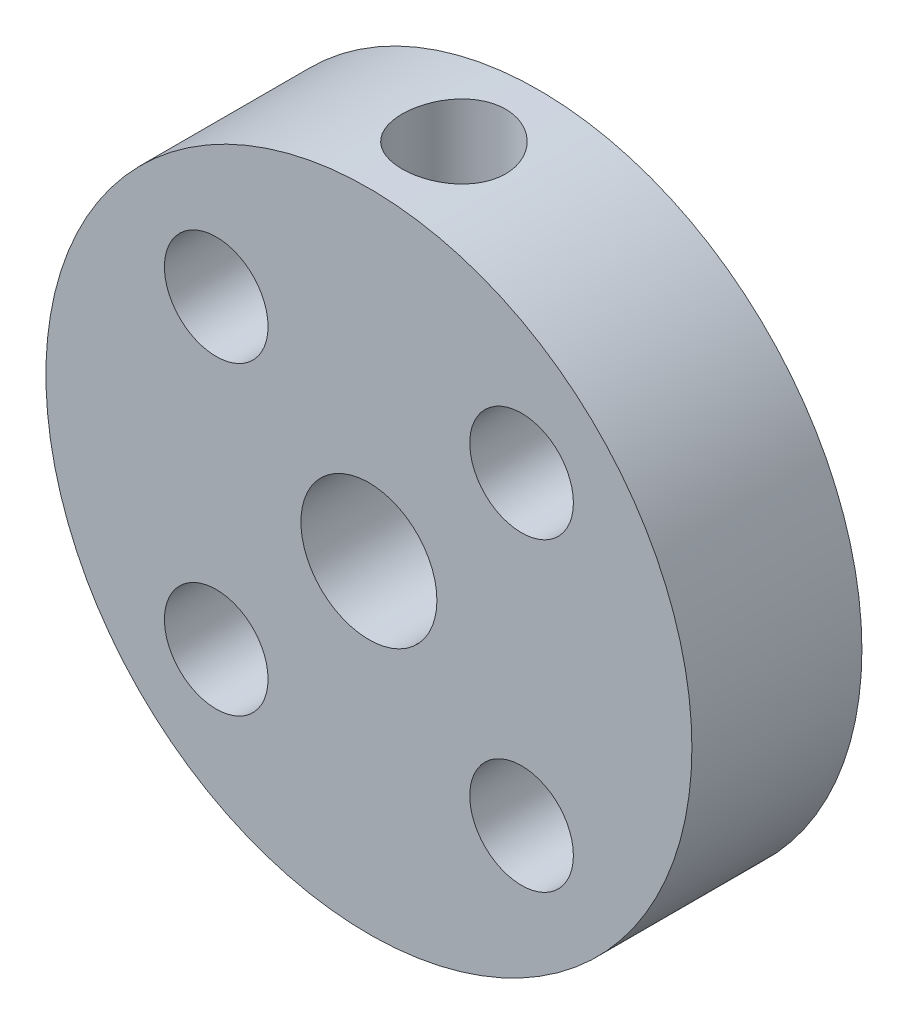
ISO-10303-21;
HEADER;
FILE_DESCRIPTION(('STEP AP214'),'2;1');
FILE_NAME('part.step','',(''),(''),'','','');
FILE_SCHEMA(('AUTOMOTIVE_DESIGN { 1 0 10303 214 1 1 1 1 }'));
ENDSEC;
DATA;
#1=APPLICATION_CONTEXT('core data for automotive mechanical design processes');
#2=APPLICATION_PROTOCOL_DEFINITION('international standard','automotive_design',2000,#1);
#3=PRODUCT_CONTEXT('',#1,'mechanical');
#4=PRODUCT('Part','Part','',(#3));
#5=PRODUCT_RELATED_PRODUCT_CATEGORY('part','',(#4));
#6=PRODUCT_DEFINITION_FORMATION('','',#4);
#7=PRODUCT_DEFINITION_CONTEXT('part definition',#1,'design');
#8=PRODUCT_DEFINITION('design','',#6,#7);
#9=PRODUCT_DEFINITION_SHAPE('','',#8);
#10=(LENGTH_UNIT() NAMED_UNIT(*) SI_UNIT(.MILLI.,.METRE.));
#11=(NAMED_UNIT(*) PLANE_ANGLE_UNIT() SI_UNIT($,.RADIAN.));
#12=(NAMED_UNIT(*) SI_UNIT($,.STERADIAN.) SOLID_ANGLE_UNIT());
#13=UNCERTAINTY_MEASURE_WITH_UNIT(LENGTH_MEASURE(1.E-05),#10,'distance_accuracy_value','');
#14=(GEOMETRIC_REPRESENTATION_CONTEXT(3) GLOBAL_UNCERTAINTY_ASSIGNED_CONTEXT((#13)) GLOBAL_UNIT_ASSIGNED_CONTEXT((#10,
#11,#12)) REPRESENTATION_CONTEXT('',''));
#15=CARTESIAN_POINT('',(0.,0.,0.));
#16=DIRECTION('',(0.,0.,1.));
#17=DIRECTION('',(1.,0.,0.));
#18=AXIS2_PLACEMENT_3D('',#15,#16,#17);
#19=CARTESIAN_POINT('',(0.,0.,5.));
#20=DIRECTION('',(0.,0.,1.));
#21=DIRECTION('',(1.,0.,0.));
#22=AXIS2_PLACEMENT_3D('',#19,#20,#21);
#23=PLANE('',#22);
#24=CARTESIAN_POINT('',(-4.49012806053454,4.49012806053462,5.));
#25=DIRECTION('',(0.,0.,1.));
#26=DIRECTION('',(1.,0.,0.));
#27=AXIS2_PLACEMENT_3D('',#24,#25,#26);
#28=CIRCLE('',#27,1.524);
#29=CARTESIAN_POINT('',(-2.96612806053454,4.49012806053462,5.));
#30=VERTEX_POINT('',#29);
#31=EDGE_CURVE('E64',#30,#30,#28,.T.);
#32=ORIENTED_EDGE('',*,*,#31,.F.);
#33=EDGE_LOOP('',(#32));
#34=FACE_BOUND('',#33,.T.);
#35=CARTESIAN_POINT('',(0.,0.,5.));
#36=DIRECTION('',(0.,0.,1.));
#37=DIRECTION('',(1.,0.,0.));
#38=AXIS2_PLACEMENT_3D('',#35,#36,#37);
#39=CIRCLE('',#38,2.);
#40=CARTESIAN_POINT('',(2.,0.,5.));
#41=VERTEX_POINT('',#40);
#42=EDGE_CURVE('E52',#41,#41,#39,.T.);
#43=ORIENTED_EDGE('',*,*,#42,.F.);
#44=EDGE_LOOP('',(#43));
#45=FACE_BOUND('',#44,.T.);
#46=CARTESIAN_POINT('',(0.,0.,5.));
#47=DIRECTION('',(0.,0.,1.));
#48=DIRECTION('',(1.,0.,0.));
#49=AXIS2_PLACEMENT_3D('',#46,#47,#48);
#50=CIRCLE('',#49,9.5);
#51=CARTESIAN_POINT('',(9.5,0.,5.));
#52=VERTEX_POINT('',#51);
#53=EDGE_CURVE('E10',#52,#52,#50,.T.);
#54=ORIENTED_EDGE('',*,*,#53,.T.);
#55=EDGE_LOOP('',(#54));
#56=FACE_BOUND('',#55,.T.);
#57=CARTESIAN_POINT('',(4.49012806053457,-4.49012806053458,5.));
#58=DIRECTION('',(0.,0.,1.));
#59=DIRECTION('',(1.,0.,0.));
#60=AXIS2_PLACEMENT_3D('',#57,#58,#59);
#61=CIRCLE('',#60,1.524);
#62=CARTESIAN_POINT('',(6.01412806053457,-4.49012806053458,5.));
#63=VERTEX_POINT('',#62);
#64=EDGE_CURVE('E47',#63,#63,#61,.T.);
#65=ORIENTED_EDGE('',*,*,#64,.F.);
#66=EDGE_LOOP('',(#65));
#67=FACE_BOUND('',#66,.T.);
#68=CARTESIAN_POINT('',(-4.4901280605346,-4.49012806053455,5.));
#69=DIRECTION('',(0.,0.,1.));
#70=DIRECTION('',(1.,0.,0.));
#71=AXIS2_PLACEMENT_3D('',#68,#69,#70);
#72=CIRCLE('',#71,1.524);
#73=CARTESIAN_POINT('',(-2.9661280605346,-4.49012806053455,5.));
#74=VERTEX_POINT('',#73);
#75=EDGE_CURVE('E58',#74,#74,#72,.T.);
#76=ORIENTED_EDGE('',*,*,#75,.F.);
#77=EDGE_LOOP('',(#76));
#78=FACE_BOUND('',#77,.T.);
#79=CARTESIAN_POINT('',(4.49012806053463,4.49012806053452,5.));
#80=DIRECTION('',(0.,0.,1.));
#81=DIRECTION('',(1.,0.,0.));
#82=AXIS2_PLACEMENT_3D('',#79,#80,#81);
#83=CIRCLE('',#82,1.524);
#84=CARTESIAN_POINT('',(6.01412806053463,4.49012806053452,5.));
#85=VERTEX_POINT('',#84);
#86=EDGE_CURVE('E70',#85,#85,#83,.T.);
#87=ORIENTED_EDGE('',*,*,#86,.F.);
#88=EDGE_LOOP('',(#87));
#89=FACE_BOUND('',#88,.T.);
#90=ADVANCED_FACE('F36',(#34,#45,#56,#67,#78,#89),#23,.T.);
#91=CARTESIAN_POINT('',(0.,0.,0.));
#92=DIRECTION('',(0.,0.,1.));
#93=DIRECTION('',(1.,0.,0.));
#94=AXIS2_PLACEMENT_3D('',#91,#92,#93);
#95=PLANE('',#94);
#96=CARTESIAN_POINT('',(-4.49012806053454,4.49012806053462,0.));
#97=DIRECTION('',(0.,0.,1.));
#98=DIRECTION('',(1.,0.,0.));
#99=AXIS2_PLACEMENT_3D('',#96,#97,#98);
#100=CIRCLE('',#99,1.524);
#101=CARTESIAN_POINT('',(-2.96612806053454,4.49012806053462,0.));
#102=VERTEX_POINT('',#101);
#103=EDGE_CURVE('E67',#102,#102,#100,.T.);
#104=ORIENTED_EDGE('',*,*,#103,.T.);
#105=EDGE_LOOP('',(#104));
#106=FACE_BOUND('',#105,.T.);
#107=CARTESIAN_POINT('',(0.,0.,0.));
#108=DIRECTION('',(0.,0.,1.));
#109=DIRECTION('',(1.,0.,0.));
#110=AXIS2_PLACEMENT_3D('',#107,#108,#109);
#111=CIRCLE('',#110,2.);
#112=CARTESIAN_POINT('',(2.,0.,0.));
#113=VERTEX_POINT('',#112);
#114=EDGE_CURVE('E55',#113,#113,#111,.T.);
#115=ORIENTED_EDGE('',*,*,#114,.T.);
#116=EDGE_LOOP('',(#115));
#117=FACE_BOUND('',#116,.T.);
#118=CARTESIAN_POINT('',(0.,0.,0.));
#119=DIRECTION('',(0.,0.,1.));
#120=DIRECTION('',(1.,0.,0.));
#121=AXIS2_PLACEMENT_3D('',#118,#119,#120);
#122=CIRCLE('',#121,9.5);
#123=CARTESIAN_POINT('',(9.5,0.,0.));
#124=VERTEX_POINT('',#123);
#125=EDGE_CURVE('E40',#124,#124,#122,.T.);
#126=ORIENTED_EDGE('',*,*,#125,.F.);
#127=EDGE_LOOP('',(#126));
#128=FACE_BOUND('',#127,.T.);
#129=CARTESIAN_POINT('',(4.49012806053457,-4.49012806053458,0.));
#130=DIRECTION('',(0.,0.,1.));
#131=DIRECTION('',(1.,0.,0.));
#132=AXIS2_PLACEMENT_3D('',#129,#130,#131);
#133=CIRCLE('',#132,1.524);
#134=CARTESIAN_POINT('',(6.01412806053457,-4.49012806053458,0.));
#135=VERTEX_POINT('',#134);
#136=EDGE_CURVE('E49',#135,#135,#133,.T.);
#137=ORIENTED_EDGE('',*,*,#136,.T.);
#138=EDGE_LOOP('',(#137));
#139=FACE_BOUND('',#138,.T.);
#140=CARTESIAN_POINT('',(-4.4901280605346,-4.49012806053455,0.));
#141=DIRECTION('',(0.,0.,1.));
#142=DIRECTION('',(1.,0.,0.));
#143=AXIS2_PLACEMENT_3D('',#140,#141,#142);
#144=CIRCLE('',#143,1.524);
#145=CARTESIAN_POINT('',(-2.9661280605346,-4.49012806053455,0.));
#146=VERTEX_POINT('',#145);
#147=EDGE_CURVE('E61',#146,#146,#144,.T.);
#148=ORIENTED_EDGE('',*,*,#147,.T.);
#149=EDGE_LOOP('',(#148));
#150=FACE_BOUND('',#149,.T.);
#151=CARTESIAN_POINT('',(4.49012806053463,4.49012806053452,0.));
#152=DIRECTION('',(0.,0.,1.));
#153=DIRECTION('',(1.,0.,0.));
#154=AXIS2_PLACEMENT_3D('',#151,#152,#153);
#155=CIRCLE('',#154,1.524);
#156=CARTESIAN_POINT('',(6.01412806053463,4.49012806053452,0.));
#157=VERTEX_POINT('',#156);
#158=EDGE_CURVE('E73',#157,#157,#155,.T.);
#159=ORIENTED_EDGE('',*,*,#158,.T.);
#160=EDGE_LOOP('',(#159));
#161=FACE_BOUND('',#160,.T.);
#162=ADVANCED_FACE('F119',(#106,#117,#128,#139,#150,#161),#95,.F.);
#163=CARTESIAN_POINT('',(0.,0.,5.));
#164=DIRECTION('',(0.,0.,-1.));
#165=DIRECTION('',(-1.,0.,0.));
#166=AXIS2_PLACEMENT_3D('',#163,#164,#165);
#167=CYLINDRICAL_SURFACE('',#166,9.5);
#168=CARTESIAN_POINT('',(1.5240000000001,9.37696240794426,2.5));
#169=CARTESIAN_POINT('',(1.52399654514369,9.37696390238986,2.58501071690145));
#170=CARTESIAN_POINT('',(1.51686291108887,9.37813097947758,2.67006898997693));
#171=CARTESIAN_POINT('',(1.48852738850002,9.38266935539468,2.83780222077803));
#172=CARTESIAN_POINT('',(1.46731223691527,9.38604273224212,2.92047485485083));
#173=CARTESIAN_POINT('',(1.41146916769715,9.39460202859444,3.08098489590663));
#174=CARTESIAN_POINT('',(1.37685210490034,9.39978648089324,3.15882615699273));
#175=CARTESIAN_POINT('',(1.2952143479522,9.41138203343417,3.30758608763933));
#176=CARTESIAN_POINT('',(1.24819516977142,9.41779298372922,3.37850560182789));
#177=CARTESIAN_POINT('',(1.14262924417084,9.43118467233009,3.51206655872565));
#178=CARTESIAN_POINT('',(1.08399136273363,9.43816964186715,3.57463555486662));
#179=CARTESIAN_POINT('',(0.957049442106809,9.45188468406259,3.6890906726252));
#180=CARTESIAN_POINT('',(0.888744846694101,9.45861474202508,3.74097617909236));
#181=CARTESIAN_POINT('',(0.743940986216308,9.47110625539872,3.83286165255477));
#182=CARTESIAN_POINT('',(0.667398586832956,9.47686216171781,3.87279446219513));
#183=CARTESIAN_POINT('',(0.508584890338842,9.48670983471568,3.93920960280203));
#184=CARTESIAN_POINT('',(0.426313938984797,9.49080170172864,3.96569274474786));
#185=CARTESIAN_POINT('',(0.259126136306113,9.49683039064271,4.00423594936001));
#186=CARTESIAN_POINT('',(0.17423797874748,9.49878536842639,4.01641759016988));
#187=CARTESIAN_POINT('',(0.00360158507503608,9.5003823262355,4.02638984534965));
#188=CARTESIAN_POINT('',(-0.0821465963501227,9.500024452415,4.02418136906188));
#189=CARTESIAN_POINT('',(-0.251238389724529,9.49705045379422,4.00553133172077));
#190=CARTESIAN_POINT('',(-0.334596848200569,9.49445508658029,3.98922059559731));
#191=CARTESIAN_POINT('',(-0.497378116450145,9.48732084875568,3.94303479202387));
#192=CARTESIAN_POINT('',(-0.576800813298291,9.48278192241613,3.91315933562281));
#193=CARTESIAN_POINT('',(-0.729847775059533,9.47223508175527,3.84056062123073));
#194=CARTESIAN_POINT('',(-0.803445810860905,9.46622097282111,3.79778300565138));
#195=CARTESIAN_POINT('',(-0.942468349551945,9.45339275864658,3.70063404212941));
#196=CARTESIAN_POINT('',(-1.00789223793547,9.44657859333515,3.64626182337246));
#197=CARTESIAN_POINT('',(-1.12948161087487,9.43281847520847,3.52674023027444));
#198=CARTESIAN_POINT('',(-1.18553472984518,9.42587190205809,3.46147655823148));
#199=CARTESIAN_POINT('',(-1.28591204516272,9.41270423425635,3.32241100501416));
#200=CARTESIAN_POINT('',(-1.3302361481558,9.40648314537953,3.24860905588826));
#201=CARTESIAN_POINT('',(-1.40591663975554,9.39547068759003,3.09443670905587));
#202=CARTESIAN_POINT('',(-1.43726026606153,9.39068072703369,3.01405993955356));
#203=CARTESIAN_POINT('',(-1.48597059778895,9.38309676527278,2.8490885510639));
#204=CARTESIAN_POINT('',(-1.50333843813255,9.38030260199892,2.76449427515733));
#205=CARTESIAN_POINT('',(-1.52344755980677,9.37705772673272,2.59449238568458));
#206=CARTESIAN_POINT('',(-1.52634867384512,9.37658140792975,2.5091041508594));
#207=CARTESIAN_POINT('',(-1.51786721675787,9.37795803268871,2.33906169148613));
#208=CARTESIAN_POINT('',(-1.50648515513079,9.37981089316594,2.25440744086438));
#209=CARTESIAN_POINT('',(-1.46989644206301,9.38561349999468,2.08873883040995));
#210=CARTESIAN_POINT('',(-1.44477047866694,9.38955100347972,2.00770618365153));
#211=CARTESIAN_POINT('',(-1.38149155259922,9.39906903469868,1.85100203475306));
#212=CARTESIAN_POINT('',(-1.34333786258204,9.40464965416633,1.77533083223043));
#213=CARTESIAN_POINT('',(-1.25470667855904,9.41688494266829,1.63078426382327));
#214=CARTESIAN_POINT('',(-1.20412635732697,9.42354840764833,1.56197270592282));
#215=CARTESIAN_POINT('',(-1.09221953238032,9.43717256366097,1.4337569642718));
#216=CARTESIAN_POINT('',(-1.03089233043107,9.44413327398364,1.37435339224438));
#217=CARTESIAN_POINT('',(-0.898526095957376,9.45764824984943,1.26605995199878));
#218=CARTESIAN_POINT('',(-0.827399533915524,9.46419797532292,1.21727641877326));
#219=CARTESIAN_POINT('',(-0.677867825574215,9.47608106642354,1.13235112126941));
#220=CARTESIAN_POINT('',(-0.599462901163406,9.48141446911444,1.09620897176505));
#221=CARTESIAN_POINT('',(-0.437922196736007,9.49024419104279,1.03775957527702));
#222=CARTESIAN_POINT('',(-0.354807326083839,9.49374801765891,1.01539572210047));
#223=CARTESIAN_POINT('',(-0.185941062817749,9.49855545456664,0.984955101731097));
#224=CARTESIAN_POINT('',(-0.100189871033508,9.49985923203282,0.976877248989415));
#225=CARTESIAN_POINT('',(0.0704866294857125,9.50011757344635,0.975267336486232));
#226=CARTESIAN_POINT('',(0.155410413212864,9.49909832369643,0.981573137774859));
#227=CARTESIAN_POINT('',(0.322972936038544,9.49487833658826,1.00820205813467));
#228=CARTESIAN_POINT('',(0.405611685701257,9.4916776093172,1.02852511238993));
#229=CARTESIAN_POINT('',(0.566203106303296,9.48345285149482,1.08255120999206));
#230=CARTESIAN_POINT('',(0.644160179365784,9.47843056604109,1.11624145013816));
#231=CARTESIAN_POINT('',(0.793340296417441,9.46711224448121,1.19602783749375));
#232=CARTESIAN_POINT('',(0.864563059349206,9.46081615524708,1.24212450217859));
#233=CARTESIAN_POINT('',(0.999071800668819,9.44756467903416,1.34599450572862));
#234=CARTESIAN_POINT('',(1.06226517545129,9.44060298473112,1.40388697117544));
#235=CARTESIAN_POINT('',(1.1780981547874,9.42684973557823,1.52945482084182));
#236=CARTESIAN_POINT('',(1.23073528318921,9.42005822097314,1.59713249396066));
#237=CARTESIAN_POINT('',(1.32427343081012,9.40736673985615,1.74087027255233));
#238=CARTESIAN_POINT('',(1.36509594095315,9.40147285538368,1.81698200472422));
#239=CARTESIAN_POINT('',(1.43331477885184,9.39131558806267,1.97504387862434));
#240=CARTESIAN_POINT('',(1.46072472145657,9.38705055276927,2.05698800278101));
#241=CARTESIAN_POINT('',(1.49528348488917,9.38159511747144,2.19939221681204));
#242=CARTESIAN_POINT('',(1.50603521356294,9.3798673361157,2.25898310501399));
#243=CARTESIAN_POINT('',(1.52039464306861,9.37755045877188,2.37904131170051));
#244=CARTESIAN_POINT('',(1.52400245838479,9.37696134453618,2.43950861612449));
#245=CARTESIAN_POINT('',(1.5240000000001,9.37696240794426,2.5));
#246=B_SPLINE_CURVE_WITH_KNOTS('',3,(#168,#169,#170,#171,#172,#173,#174,#175,#176,#177,#178,
#179,#180,#181,#182,#183,#184,#185,#186,#187,#188,#189,#190,#191,#192,#193,#194,#195,#196,#197,
#198,#199,#200,#201,#202,#203,#204,#205,#206,#207,#208,#209,#210,#211,#212,#213,#214,#215,#216,
#217,#218,#219,#220,#221,#222,#223,#224,#225,#226,#227,#228,#229,#230,#231,#232,#233,#234,#235,
#236,#237,#238,#239,#240,#241,#242,#243,#244,#245),.UNSPECIFIED.,.T.,.F.,(4,2,2,2,2,2,2,2,2,2,2,
2,2,2,2,2,2,2,2,2,2,2,2,2,2,2,2,2,2,2,2,2,2,2,2,2,2,2,4),(0.,0.254810985374879,
0.509862312448348,0.764707492214811,1.0195215354466,1.27641959439023,1.53333244127269,
1.79166279139221,2.04997756302697,2.30608010436577,2.56216646219317,2.81590232226082,
3.0696454583408,3.32447292778566,3.57931954282903,3.83703148010774,4.09474546851791,
4.35271224112767,4.61065806309022,4.86574760906008,5.12082805592963,5.37442679676301,
5.62803969847675,5.88382637613994,6.13962967866325,6.39788713011159,6.6561367108898,
6.91331810841172,7.17047996267746,7.42475731917507,7.67903349989947,7.9330667184703,
8.18711053447866,8.44385987913448,8.70066937856926,8.95914814900743,9.21736399532022,
9.39868367728099,9.58000045349262),.UNSPECIFIED.);
#247=CARTESIAN_POINT('',(1.5240000000001,9.37696240794426,2.5));
#248=VERTEX_POINT('',#247);
#249=EDGE_CURVE('E85',#248,#248,#246,.T.);
#250=ORIENTED_EDGE('',*,*,#249,.T.);
#251=EDGE_LOOP('',(#250));
#252=FACE_BOUND('',#251,.T.);
#253=ORIENTED_EDGE('',*,*,#53,.F.);
#254=EDGE_LOOP('',(#253));
#255=FACE_BOUND('',#254,.T.);
#256=ORIENTED_EDGE('',*,*,#125,.T.);
#257=EDGE_LOOP('',(#256));
#258=FACE_BOUND('',#257,.T.);
#259=ADVANCED_FACE('F38',(#252,#255,#258),#167,.T.);
#260=CARTESIAN_POINT('',(4.49012806053457,-4.49012806053458,5.));
#261=DIRECTION('',(0.,0.,-1.));
#262=DIRECTION('',(-1.,0.,0.));
#263=AXIS2_PLACEMENT_3D('',#260,#261,#262);
#264=CYLINDRICAL_SURFACE('',#263,1.524);
#265=ORIENTED_EDGE('',*,*,#64,.T.);
#266=EDGE_LOOP('',(#265));
#267=FACE_BOUND('',#266,.T.);
#268=ORIENTED_EDGE('',*,*,#136,.F.);
#269=EDGE_LOOP('',(#268));
#270=FACE_BOUND('',#269,.T.);
#271=ADVANCED_FACE('F113',(#267,#270),#264,.F.);
#272=CARTESIAN_POINT('',(0.,0.,5.));
#273=DIRECTION('',(0.,0.,-1.));
#274=DIRECTION('',(-1.,0.,0.));
#275=AXIS2_PLACEMENT_3D('',#272,#273,#274);
#276=CYLINDRICAL_SURFACE('',#275,2.);
#277=CARTESIAN_POINT('',(-1.52399999999999,1.29515404489197,2.5));
#278=CARTESIAN_POINT('',(-1.52399421916148,1.29516623565458,2.57060825734175));
#279=CARTESIAN_POINT('',(-1.51903279827602,1.30106731822181,2.64124739238356));
#280=CARTESIAN_POINT('',(-1.49976574238623,1.32321452959572,2.77965596898253));
#281=CARTESIAN_POINT('',(-1.48542708024429,1.33949721786304,2.84741436269585));
#282=CARTESIAN_POINT('',(-1.44474852864486,1.38338686556629,2.99197823948771));
#283=CARTESIAN_POINT('',(-1.41653054477789,1.4126464671989,3.06772706842777));
#284=CARTESIAN_POINT('',(-1.34980052447415,1.4765424198077,3.21200589495658));
#285=CARTESIAN_POINT('',(-1.31127530889127,1.51118563049449,3.28052649280424));
#286=CARTESIAN_POINT('',(-1.22369730312764,1.58298888668634,3.41187450140446));
#287=CARTESIAN_POINT('',(-1.17441292904368,1.62018949071468,3.47452465443045));
#288=CARTESIAN_POINT('',(-1.06629275806168,1.69330383637713,3.59176236206206));
#289=CARTESIAN_POINT('',(-1.0074639613786,1.72921849777752,3.64635577014838));
#290=CARTESIAN_POINT('',(-0.883208363491041,1.79574493210566,3.7443918341972));
#291=CARTESIAN_POINT('',(-0.818164251420892,1.82651642811272,3.78820754026351));
#292=CARTESIAN_POINT('',(-0.68018699547095,1.88224934664388,3.86608098472868));
#293=CARTESIAN_POINT('',(-0.607261321845251,1.90721620135881,3.90014785338851));
#294=CARTESIAN_POINT('',(-0.466236873311948,1.94606016540618,3.95257917672693));
#295=CARTESIAN_POINT('',(-0.399031966189002,1.96103406866266,3.97252501266667));
#296=CARTESIAN_POINT('',(-0.261384596613452,1.98407048980526,4.00306803331205));
#297=CARTESIAN_POINT('',(-0.190944211561674,1.99213737888032,4.01367113080853));
#298=CARTESIAN_POINT('',(-0.0486076710990711,2.00068304332902,4.02490072544639));
#299=CARTESIAN_POINT('',(0.0232919386857243,2.00114100663794,4.02549985959728));
#300=CARTESIAN_POINT('',(0.166098227177259,1.99437289846607,4.01661048779116));
#301=CARTESIAN_POINT('',(0.237004745099431,1.98714559696098,4.00712036705205));
#302=CARTESIAN_POINT('',(0.372908888013028,1.9660825612137,3.97923478780387));
#303=CARTESIAN_POINT('',(0.438029540422947,1.95252732519566,3.96121690925352));
#304=CARTESIAN_POINT('',(0.564083092464911,1.91990992714313,3.91733728914929));
#305=CARTESIAN_POINT('',(0.625015047344726,1.90084652776556,3.8914737851042));
#306=CARTESIAN_POINT('',(0.748015416121635,1.85612444569086,3.8297648793567));
#307=CARTESIAN_POINT('',(0.809519056440308,1.82998072786655,3.79315176725074));
#308=CARTESIAN_POINT('',(0.925739805305479,1.77402769254156,3.71267757534331));
#309=CARTESIAN_POINT('',(0.980451538350143,1.74421550829802,3.66881081782065));
#310=CARTESIAN_POINT('',(1.0930243534027,1.67643330120276,3.5652878543628));
#311=CARTESIAN_POINT('',(1.14932994253336,1.63802357387576,3.50422813872816));
#312=CARTESIAN_POINT('',(1.25144787664799,1.56139291259451,3.37368822596618));
#313=CARTESIAN_POINT('',(1.29725324317889,1.52317212061874,3.30420247551795));
#314=CARTESIAN_POINT('',(1.37040765269517,1.45737797654635,3.17028652174415));
#315=CARTESIAN_POINT('',(1.39959474080719,1.42912644014071,3.10719766600638));
#316=CARTESIAN_POINT('',(1.44958213742573,1.37839757738703,2.97562051234814));
#317=CARTESIAN_POINT('',(1.47040134992521,1.35590727794091,2.90714480755026));
#318=CARTESIAN_POINT('',(1.4989111650399,1.3242433281659,2.78114568582743));
#319=CARTESIAN_POINT('',(1.50848179371125,1.3132290786088,2.72452400602605));
#320=CARTESIAN_POINT('',(1.5211438557459,1.29854587455434,2.60965028418081));
#321=CARTESIAN_POINT('',(1.52424489815438,1.29486602689551,2.55140079047108));
#322=CARTESIAN_POINT('',(1.52372425128499,1.29547836389447,2.43488524129572));
#323=CARTESIAN_POINT('',(1.52009210000798,1.29978295473477,2.37661930094127));
#324=CARTESIAN_POINT('',(1.5063892681686,1.31563489134913,2.26183600897652));
#325=CARTESIAN_POINT('',(1.49630875857414,1.32719329337213,2.20532146508025));
#326=CARTESIAN_POINT('',(1.46579212439987,1.36092857948075,2.07589027526871));
#327=CARTESIAN_POINT('',(1.44296702563769,1.38540554629503,2.00415151737352));
#328=CARTESIAN_POINT('',(1.38815437820569,1.44032473100911,1.86666482001918));
#329=CARTESIAN_POINT('',(1.3561402851182,1.47078414886271,1.80093497454774));
#330=CARTESIAN_POINT('',(1.27291843413175,1.54388950190127,1.65671907814318));
#331=CARTESIAN_POINT('',(1.21883389830165,1.58744344617933,1.58035068663941));
#332=CARTESIAN_POINT('',(1.09745566153531,1.67366106911659,1.43846111001892));
#333=CARTESIAN_POINT('',(1.03017139552958,1.71632535972677,1.3729322383147));
#334=CARTESIAN_POINT('',(0.895857451318234,1.7894739716077,1.26465408090385));
#335=CARTESIAN_POINT('',(0.830876152181805,1.82077930455541,1.21992552984517));
#336=CARTESIAN_POINT('',(0.692881776888648,1.87762059743631,1.14028928373022));
#337=CARTESIAN_POINT('',(0.61988088211575,1.90316513237549,1.10536697273555));
#338=CARTESIAN_POINT('',(0.478794865777206,1.94300905802654,1.05150627136105));
#339=CARTESIAN_POINT('',(0.411648831559382,1.95842746369055,1.03094527198329));
#340=CARTESIAN_POINT('',(0.273983602282365,1.98237298508784,0.999170525643835));
#341=CARTESIAN_POINT('',(0.203466179194685,1.99090367966662,0.987951924289266));
#342=CARTESIAN_POINT('',(0.0608282489300775,2.00035533053874,0.975528276940307));
#343=CARTESIAN_POINT('',(-0.0112962961823612,2.00125426192445,0.974352213177774));
#344=CARTESIAN_POINT('',(-0.154666594816647,1.99530129496316,0.982169461098804));
#345=CARTESIAN_POINT('',(-0.225912251082172,1.98844854646989,0.991163888205706));
#346=CARTESIAN_POINT('',(-0.362289023662363,1.9680686551138,1.01812839614435));
#347=CARTESIAN_POINT('',(-0.427551165983504,1.95485166038504,1.03568182971962));
#348=CARTESIAN_POINT('',(-0.553955947503129,1.92285949291813,1.07867304513047));
#349=CARTESIAN_POINT('',(-0.615097645428126,1.90408305543008,1.10411262109229));
#350=CARTESIAN_POINT('',(-0.738365107634951,1.8599811447178,1.16486416660701));
#351=CARTESIAN_POINT('',(-0.799951751733327,1.83418222372092,1.20091981893632));
#352=CARTESIAN_POINT('',(-0.916415595084816,1.77886124984728,1.28027349104599));
#353=CARTESIAN_POINT('',(-0.97128769509453,1.74933640152078,1.32357695668313));
#354=CARTESIAN_POINT('',(-1.08423290202404,1.68213184377939,1.42579410324731));
#355=CARTESIAN_POINT('',(-1.14077535194938,1.64399750319663,1.48609981813004));
#356=CARTESIAN_POINT('',(-1.24349583344739,1.56773892840401,1.6150702986005));
#357=CARTESIAN_POINT('',(-1.28966648044835,1.52961472057678,1.68374096660046));
#358=CARTESIAN_POINT('',(-1.36425765775442,1.46317101883944,1.81719938308244));
#359=CARTESIAN_POINT('',(-1.39434968155645,1.43427137067385,1.8807603400777));
#360=CARTESIAN_POINT('',(-1.4459910835627,1.38219171883302,2.01345106409662));
#361=CARTESIAN_POINT('',(-1.46755847054866,1.35899969703737,2.08256871624891));
#362=CARTESIAN_POINT('',(-1.49717682853682,1.32621366751234,2.20967439759879));
#363=CARTESIAN_POINT('',(-1.50716883584083,1.31474111972802,2.26671020848402));
#364=CARTESIAN_POINT('',(-1.52057705399778,1.29921274659533,2.38249234254515));
#365=CARTESIAN_POINT('',(-1.52400481116837,1.2951438989916,2.44123547741521));
#366=CARTESIAN_POINT('',(-1.52399999999999,1.29515404489197,2.5));
#367=B_SPLINE_CURVE_WITH_KNOTS('',3,(#277,#278,#279,#280,#281,#282,#283,#284,#285,#286,#287,
#288,#289,#290,#291,#292,#293,#294,#295,#296,#297,#298,#299,#300,#301,#302,#303,#304,#305,#306,
#307,#308,#309,#310,#311,#312,#313,#314,#315,#316,#317,#318,#319,#320,#321,#322,#323,#324,#325,
#326,#327,#328,#329,#330,#331,#332,#333,#334,#335,#336,#337,#338,#339,#340,#341,#342,#343,#344,
#345,#346,#347,#348,#349,#350,#351,#352,#353,#354,#355,#356,#357,#358,#359,#360,#361,#362,#363,
#364,#365,#366),.UNSPECIFIED.,.T.,.F.,(4,2,2,2,2,2,2,2,2,2,2,2,2,2,2,2,2,2,2,2,2,2,2,2,2,2,2,2,
2,2,2,2,2,2,2,2,2,2,2,2,2,2,2,2,4),(0.,0.211515994439567,0.423781000758994,0.680274099689582,
0.937096739124908,1.20011606742437,1.46294335300424,1.71469095215403,1.96620199996655,
2.18032651829592,2.39431542491495,2.60888954161197,2.82349800600063,3.02938493637253,
3.23531815278871,3.4630908939616,3.69104277341641,3.96454721198246,4.23823289811919,
4.46265505440887,4.68656732646889,4.86125375543716,5.03568054364548,5.21037858242684,
5.38534354458067,5.6215129252353,5.85837151976511,6.16654298840108,6.47449497894303,
6.72812939825911,6.98138375101295,7.19614824768222,7.41080108106094,7.62607318253296,
7.84136889572841,8.0470967355325,8.25287141356429,8.47969549443169,8.70669077768384,
8.97879312042894,9.25108858632184,9.47848555666934,9.70539953696148,9.88174659615906,
10.0577831802675),.UNSPECIFIED.);
#368=CARTESIAN_POINT('',(-1.52399999999999,1.29515404489197,2.5));
#369=VERTEX_POINT('',#368);
#370=EDGE_CURVE('E76',#369,#369,#367,.T.);
#371=ORIENTED_EDGE('',*,*,#370,.T.);
#372=EDGE_LOOP('',(#371));
#373=FACE_BOUND('',#372,.T.);
#374=ORIENTED_EDGE('',*,*,#42,.T.);
#375=EDGE_LOOP('',(#374));
#376=FACE_BOUND('',#375,.T.);
#377=ORIENTED_EDGE('',*,*,#114,.F.);
#378=EDGE_LOOP('',(#377));
#379=FACE_BOUND('',#378,.T.);
#380=ADVANCED_FACE('F109',(#373,#376,#379),#276,.F.);
#381=CARTESIAN_POINT('',(-4.4901280605346,-4.49012806053455,5.));
#382=DIRECTION('',(0.,0.,-1.));
#383=DIRECTION('',(-1.,0.,0.));
#384=AXIS2_PLACEMENT_3D('',#381,#382,#383);
#385=CYLINDRICAL_SURFACE('',#384,1.524);
#386=ORIENTED_EDGE('',*,*,#75,.T.);
#387=EDGE_LOOP('',(#386));
#388=FACE_BOUND('',#387,.T.);
#389=ORIENTED_EDGE('',*,*,#147,.F.);
#390=EDGE_LOOP('',(#389));
#391=FACE_BOUND('',#390,.T.);
#392=ADVANCED_FACE('F105',(#388,#391),#385,.F.);
#393=CARTESIAN_POINT('',(-4.49012806053454,4.49012806053462,5.));
#394=DIRECTION('',(0.,0.,-1.));
#395=DIRECTION('',(-1.,0.,0.));
#396=AXIS2_PLACEMENT_3D('',#393,#394,#395);
#397=CYLINDRICAL_SURFACE('',#396,1.524);
#398=ORIENTED_EDGE('',*,*,#31,.T.);
#399=EDGE_LOOP('',(#398));
#400=FACE_BOUND('',#399,.T.);
#401=ORIENTED_EDGE('',*,*,#103,.F.);
#402=EDGE_LOOP('',(#401));
#403=FACE_BOUND('',#402,.T.);
#404=ADVANCED_FACE('F101',(#400,#403),#397,.F.);
#405=CARTESIAN_POINT('',(4.49012806053463,4.49012806053452,5.));
#406=DIRECTION('',(0.,0.,-1.));
#407=DIRECTION('',(-1.,0.,0.));
#408=AXIS2_PLACEMENT_3D('',#405,#406,#407);
#409=CYLINDRICAL_SURFACE('',#408,1.524);
#410=ORIENTED_EDGE('',*,*,#86,.T.);
#411=EDGE_LOOP('',(#410));
#412=FACE_BOUND('',#411,.T.);
#413=ORIENTED_EDGE('',*,*,#158,.F.);
#414=EDGE_LOOP('',(#413));
#415=FACE_BOUND('',#414,.T.);
#416=ADVANCED_FACE('F97',(#412,#415),#409,.F.);
#417=CARTESIAN_POINT('',(-1.00024722013106E-13,-9.5010000000001,2.5));
#418=DIRECTION('',(0.,1.,0.));
#419=DIRECTION('',(-1.,0.,0.));
#420=AXIS2_PLACEMENT_3D('',#417,#418,#419);
#421=CYLINDRICAL_SURFACE('',#420,1.524);
#422=ORIENTED_EDGE('',*,*,#370,.F.);
#423=EDGE_LOOP('',(#422));
#424=FACE_BOUND('',#423,.T.);
#425=ORIENTED_EDGE('',*,*,#249,.F.);
#426=EDGE_LOOP('',(#425));
#427=FACE_BOUND('',#426,.T.);
#428=ADVANCED_FACE('F90',(#424,#427),#421,.F.);
#429=CLOSED_SHELL('',(#90,#162,#259,#271,#380,#392,#404,#416,#428));
#430=MANIFOLD_SOLID_BREP('B2',#429);
#431=ADVANCED_BREP_SHAPE_REPRESENTATION('',(#18,#430),#14);
#432=SHAPE_DEFINITION_REPRESENTATION(#9,#431);
ENDSEC;
END-ISO-10303-21;
